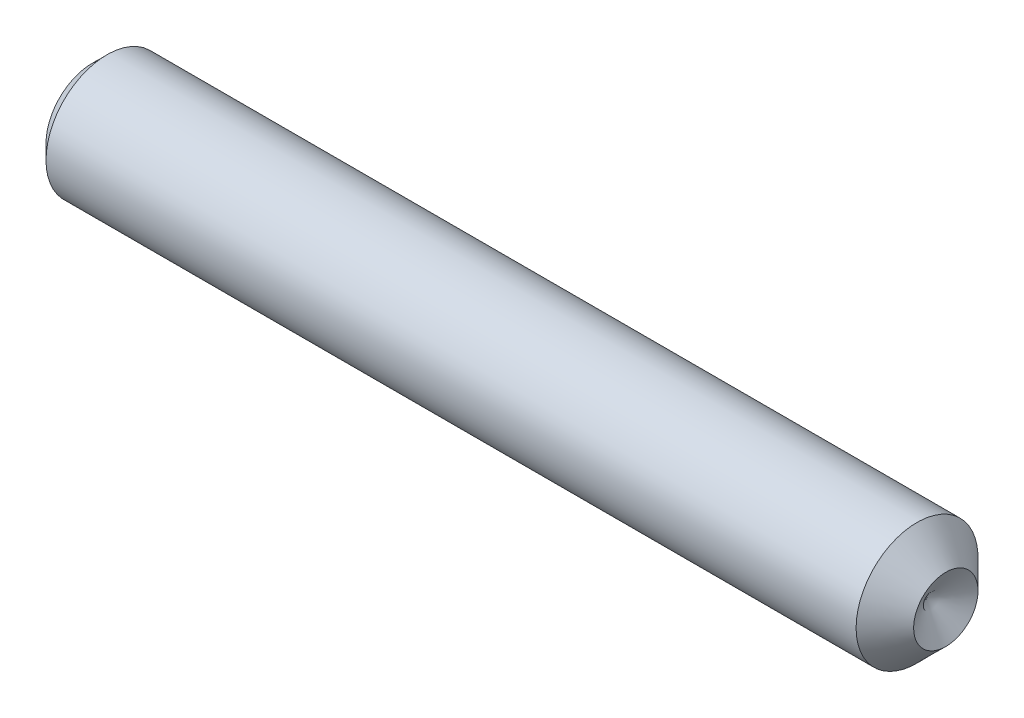
ISO-10303-21;
HEADER;
FILE_DESCRIPTION(('STEP AP214'),'2;1');
FILE_NAME('part.step','',(''),(''),'','','');
FILE_SCHEMA(('AUTOMOTIVE_DESIGN { 1 0 10303 214 1 1 1 1 }'));
ENDSEC;
DATA;
#1=APPLICATION_CONTEXT('core data for automotive mechanical design processes');
#2=APPLICATION_PROTOCOL_DEFINITION('international standard','automotive_design',2000,#1);
#3=PRODUCT_CONTEXT('',#1,'mechanical');
#4=PRODUCT('Part','Part','',(#3));
#5=PRODUCT_RELATED_PRODUCT_CATEGORY('part','',(#4));
#6=PRODUCT_DEFINITION_FORMATION('','',#4);
#7=PRODUCT_DEFINITION_CONTEXT('part definition',#1,'design');
#8=PRODUCT_DEFINITION('design','',#6,#7);
#9=PRODUCT_DEFINITION_SHAPE('','',#8);
#10=(LENGTH_UNIT() NAMED_UNIT(*) SI_UNIT(.MILLI.,.METRE.));
#11=(NAMED_UNIT(*) PLANE_ANGLE_UNIT() SI_UNIT($,.RADIAN.));
#12=(NAMED_UNIT(*) SI_UNIT($,.STERADIAN.) SOLID_ANGLE_UNIT());
#13=UNCERTAINTY_MEASURE_WITH_UNIT(LENGTH_MEASURE(1.E-05),#10,'distance_accuracy_value','');
#14=(GEOMETRIC_REPRESENTATION_CONTEXT(3) GLOBAL_UNCERTAINTY_ASSIGNED_CONTEXT((#13)) GLOBAL_UNIT_ASSIGNED_CONTEXT((#10,
#11,#12)) REPRESENTATION_CONTEXT('',''));
#15=CARTESIAN_POINT('',(0.,0.,0.));
#16=DIRECTION('',(0.,0.,1.));
#17=DIRECTION('',(1.,0.,0.));
#18=AXIS2_PLACEMENT_3D('',#15,#16,#17);
#19=CARTESIAN_POINT('',(0.,0.,0.));
#20=DIRECTION('',(-1.,0.,0.));
#21=DIRECTION('',(0.,0.,1.));
#22=AXIS2_PLACEMENT_3D('',#19,#20,#21);
#23=PLANE('',#22);
#24=CARTESIAN_POINT('',(0.,0.,0.));
#25=DIRECTION('',(-1.,0.,0.));
#26=DIRECTION('',(0.,0.,1.));
#27=AXIS2_PLACEMENT_3D('',#24,#25,#26);
#28=CIRCLE('',#27,2.41935);
#29=CARTESIAN_POINT('',(0.,0.,2.41935));
#30=VERTEX_POINT('',#29);
#31=EDGE_CURVE('E11',#30,#30,#28,.T.);
#32=ORIENTED_EDGE('',*,*,#31,.T.);
#33=EDGE_LOOP('',(#32));
#34=FACE_BOUND('',#33,.T.);
#35=DIRECTION('',(0.,0.,-1.));
#36=VECTOR('',#35,1.);
#37=CARTESIAN_POINT('',(0.,1.58750000000001,0.916543552338537));
#38=LINE('',#37,#36);
#39=CARTESIAN_POINT('',(0.,1.58750000000001,0.916543552338537));
#40=VERTEX_POINT('',#39);
#41=CARTESIAN_POINT('',(0.,1.58750000000001,-0.916543552338529));
#42=VERTEX_POINT('',#41);
#43=EDGE_CURVE('E94',#40,#42,#38,.T.);
#44=ORIENTED_EDGE('',*,*,#43,.F.);
#45=DIRECTION('',(0.,-0.86602540378444,0.499999999999998));
#46=VECTOR('',#45,1.);
#47=CARTESIAN_POINT('',(0.,1.58750000000001,0.916543552338537));
#48=LINE('',#47,#46);
#49=CARTESIAN_POINT('',(0.,0.,1.83308710467707));
#50=VERTEX_POINT('',#49);
#51=EDGE_CURVE('E47',#40,#50,#48,.T.);
#52=ORIENTED_EDGE('',*,*,#51,.T.);
#53=DIRECTION('',(0.,0.866025403784439,0.5));
#54=VECTOR('',#53,1.);
#55=CARTESIAN_POINT('',(0.,-1.5875,0.916543552338534));
#56=LINE('',#55,#54);
#57=CARTESIAN_POINT('',(0.,-1.5875,0.916543552338534));
#58=VERTEX_POINT('',#57);
#59=EDGE_CURVE('E100',#58,#50,#56,.T.);
#60=ORIENTED_EDGE('',*,*,#59,.F.);
#61=DIRECTION('',(0.,0.,-1.));
#62=VECTOR('',#61,1.);
#63=CARTESIAN_POINT('',(0.,-1.5875,0.916543552338534));
#64=LINE('',#63,#62);
#65=CARTESIAN_POINT('',(0.,-1.5875,-0.916543552338532));
#66=VERTEX_POINT('',#65);
#67=EDGE_CURVE('E120',#58,#66,#64,.T.);
#68=ORIENTED_EDGE('',*,*,#67,.T.);
#69=DIRECTION('',(0.,0.86602540378444,-0.499999999999998));
#70=VECTOR('',#69,1.);
#71=CARTESIAN_POINT('',(0.,-1.5875,-0.916543552338532));
#72=LINE('',#71,#70);
#73=CARTESIAN_POINT('',(0.,0.,-1.83308710467706));
#74=VERTEX_POINT('',#73);
#75=EDGE_CURVE('E123',#66,#74,#72,.T.);
#76=ORIENTED_EDGE('',*,*,#75,.T.);
#77=DIRECTION('',(0.,-0.866025403784439,-0.5));
#78=VECTOR('',#77,1.);
#79=CARTESIAN_POINT('',(0.,1.58750000000001,-0.916543552338529));
#80=LINE('',#79,#78);
#81=EDGE_CURVE('E126',#42,#74,#80,.T.);
#82=ORIENTED_EDGE('',*,*,#81,.F.);
#83=EDGE_LOOP('',(#44,#52,#60,#68,#76,#82));
#84=FACE_BOUND('',#83,.T.);
#85=ADVANCED_FACE('F33',(#34,#84),#23,.T.);
#86=CARTESIAN_POINT('',(0.,0.,0.));
#87=DIRECTION('',(1.,0.,0.));
#88=DIRECTION('',(0.,0.,-1.));
#89=AXIS2_PLACEMENT_3D('',#86,#87,#88);
#90=CONICAL_SURFACE('',#89,2.41935,0.785398163397437);
#91=CARTESIAN_POINT('',(0.755650000000016,0.,0.));
#92=DIRECTION('',(-1.,0.,0.));
#93=DIRECTION('',(0.,0.,1.));
#94=AXIS2_PLACEMENT_3D('',#91,#92,#93);
#95=CIRCLE('',#94,3.175);
#96=CARTESIAN_POINT('',(0.755650000000016,0.,3.175));
#97=VERTEX_POINT('',#96);
#98=EDGE_CURVE('E40',#97,#97,#95,.T.);
#99=ORIENTED_EDGE('',*,*,#98,.T.);
#100=EDGE_LOOP('',(#99));
#101=FACE_BOUND('',#100,.T.);
#102=ORIENTED_EDGE('',*,*,#31,.F.);
#103=EDGE_LOOP('',(#102));
#104=FACE_BOUND('',#103,.T.);
#105=ADVANCED_FACE('F146',(#101,#104),#90,.T.);
#106=CARTESIAN_POINT('',(-12.7,0.,0.));
#107=DIRECTION('',(-1.,0.,0.));
#108=DIRECTION('',(0.,0.,1.));
#109=AXIS2_PLACEMENT_3D('',#106,#107,#108);
#110=CYLINDRICAL_SURFACE('',#109,3.175);
#111=CARTESIAN_POINT('',(42.9514,0.,0.));
#112=DIRECTION('',(-1.,0.,0.));
#113=DIRECTION('',(0.,0.,1.));
#114=AXIS2_PLACEMENT_3D('',#111,#112,#113);
#115=CIRCLE('',#114,3.175);
#116=CARTESIAN_POINT('',(42.9514,0.,3.175));
#117=VERTEX_POINT('',#116);
#118=EDGE_CURVE('E141',#117,#117,#115,.T.);
#119=ORIENTED_EDGE('',*,*,#118,.T.);
#120=EDGE_LOOP('',(#119));
#121=FACE_BOUND('',#120,.T.);
#122=ORIENTED_EDGE('',*,*,#98,.F.);
#123=EDGE_LOOP('',(#122));
#124=FACE_BOUND('',#123,.T.);
#125=ADVANCED_FACE('F149',(#121,#124),#110,.T.);
#126=CARTESIAN_POINT('',(42.9514,0.,0.));
#127=DIRECTION('',(-1.,0.,0.));
#128=DIRECTION('',(0.,0.,1.));
#129=AXIS2_PLACEMENT_3D('',#126,#127,#128);
#130=CONICAL_SURFACE('',#129,3.175,0.785398163397454);
#131=CARTESIAN_POINT('',(44.45,0.,0.));
#132=DIRECTION('',(-1.,0.,0.));
#133=DIRECTION('',(0.,0.,1.));
#134=AXIS2_PLACEMENT_3D('',#131,#132,#133);
#135=CIRCLE('',#134,1.6764);
#136=CARTESIAN_POINT('',(44.45,0.,1.6764));
#137=VERTEX_POINT('',#136);
#138=EDGE_CURVE('E101',#137,#137,#135,.T.);
#139=ORIENTED_EDGE('',*,*,#138,.T.);
#140=EDGE_LOOP('',(#139));
#141=FACE_BOUND('',#140,.T.);
#142=ORIENTED_EDGE('',*,*,#118,.F.);
#143=EDGE_LOOP('',(#142));
#144=FACE_BOUND('',#143,.T.);
#145=ADVANCED_FACE('F151',(#141,#144),#130,.T.);
#146=CARTESIAN_POINT('',(43.4427172582622,0.,0.));
#147=DIRECTION('',(1.,0.,0.));
#148=DIRECTION('',(0.,0.,-1.));
#149=AXIS2_PLACEMENT_3D('',#146,#147,#148);
#150=CONICAL_SURFACE('',#149,0.,1.02974425867665);
#151=ORIENTED_EDGE('',*,*,#138,.F.);
#152=EDGE_LOOP('',(#151));
#153=FACE_BOUND('',#152,.T.);
#154=CARTESIAN_POINT('',(43.4427172582622,0.,0.));
#155=VERTEX_POINT('',#154);
#156=VERTEX_LOOP('',#155);
#157=FACE_BOUND('',#156,.T.);
#158=ADVANCED_FACE('F158',(#153,#157),#150,.F.);
#159=CARTESIAN_POINT('',(3.175,1.58750000000001,0.916543552338537));
#160=DIRECTION('',(0.,-0.499999999999998,-0.86602540378444));
#161=DIRECTION('',(0.,0.86602540378444,-0.499999999999998));
#162=AXIS2_PLACEMENT_3D('',#159,#160,#161);
#163=PLANE('',#162);
#164=ORIENTED_EDGE('',*,*,#51,.F.);
#165=DIRECTION('',(-1.,0.,0.));
#166=VECTOR('',#165,1.);
#167=CARTESIAN_POINT('',(3.175,1.58750000000001,0.916543552338537));
#168=LINE('',#167,#166);
#169=CARTESIAN_POINT('',(3.175,1.58750000000001,0.916543552338537));
#170=VERTEX_POINT('',#169);
#171=EDGE_CURVE('E88',#170,#40,#168,.T.);
#172=ORIENTED_EDGE('',*,*,#171,.F.);
#173=DIRECTION('',(0.,-0.86602540378444,0.499999999999998));
#174=VECTOR('',#173,1.);
#175=CARTESIAN_POINT('',(3.175,1.58750000000001,0.916543552338537));
#176=LINE('',#175,#174);
#177=CARTESIAN_POINT('',(3.175,0.,1.83308710467707));
#178=VERTEX_POINT('',#177);
#179=EDGE_CURVE('E83',#170,#178,#176,.T.);
#180=ORIENTED_EDGE('',*,*,#179,.T.);
#181=DIRECTION('',(-1.,0.,0.));
#182=VECTOR('',#181,1.);
#183=CARTESIAN_POINT('',(3.175,0.,1.83308710467707));
#184=LINE('',#183,#182);
#185=EDGE_CURVE('E86',#178,#50,#184,.T.);
#186=ORIENTED_EDGE('',*,*,#185,.T.);
#187=EDGE_LOOP('',(#164,#172,#180,#186));
#188=FACE_BOUND('',#187,.T.);
#189=ADVANCED_FACE('F85',(#188),#163,.T.);
#190=CARTESIAN_POINT('',(3.175,-1.5875,0.916543552338534));
#191=DIRECTION('',(0.,-0.5,0.866025403784439));
#192=DIRECTION('',(0.,-0.866025403784439,-0.5));
#193=AXIS2_PLACEMENT_3D('',#190,#191,#192);
#194=PLANE('',#193);
#195=ORIENTED_EDGE('',*,*,#59,.T.);
#196=ORIENTED_EDGE('',*,*,#185,.F.);
#197=DIRECTION('',(0.,0.866025403784439,0.5));
#198=VECTOR('',#197,1.);
#199=CARTESIAN_POINT('',(3.175,-1.5875,0.916543552338534));
#200=LINE('',#199,#198);
#201=CARTESIAN_POINT('',(3.175,-1.5875,0.916543552338534));
#202=VERTEX_POINT('',#201);
#203=EDGE_CURVE('E93',#202,#178,#200,.T.);
#204=ORIENTED_EDGE('',*,*,#203,.F.);
#205=DIRECTION('',(-1.,0.,0.));
#206=VECTOR('',#205,1.);
#207=CARTESIAN_POINT('',(3.175,-1.5875,0.916543552338534));
#208=LINE('',#207,#206);
#209=EDGE_CURVE('E102',#202,#58,#208,.T.);
#210=ORIENTED_EDGE('',*,*,#209,.T.);
#211=EDGE_LOOP('',(#195,#196,#204,#210));
#212=FACE_BOUND('',#211,.T.);
#213=ADVANCED_FACE('F98',(#212),#194,.F.);
#214=CARTESIAN_POINT('',(3.175,-1.5875,0.916543552338534));
#215=DIRECTION('',(0.,1.,0.));
#216=DIRECTION('',(0.,0.,1.));
#217=AXIS2_PLACEMENT_3D('',#214,#215,#216);
#218=PLANE('',#217);
#219=ORIENTED_EDGE('',*,*,#67,.F.);
#220=ORIENTED_EDGE('',*,*,#209,.F.);
#221=DIRECTION('',(0.,0.,-1.));
#222=VECTOR('',#221,1.);
#223=CARTESIAN_POINT('',(3.175,-1.5875,0.916543552338534));
#224=LINE('',#223,#222);
#225=CARTESIAN_POINT('',(3.175,-1.5875,-0.916543552338532));
#226=VERTEX_POINT('',#225);
#227=EDGE_CURVE('E107',#202,#226,#224,.T.);
#228=ORIENTED_EDGE('',*,*,#227,.T.);
#229=DIRECTION('',(-1.,0.,0.));
#230=VECTOR('',#229,1.);
#231=CARTESIAN_POINT('',(3.175,-1.5875,-0.916543552338532));
#232=LINE('',#231,#230);
#233=EDGE_CURVE('E136',#226,#66,#232,.T.);
#234=ORIENTED_EDGE('',*,*,#233,.T.);
#235=EDGE_LOOP('',(#219,#220,#228,#234));
#236=FACE_BOUND('',#235,.T.);
#237=ADVANCED_FACE('F181',(#236),#218,.T.);
#238=CARTESIAN_POINT('',(3.175,-1.5875,-0.916543552338532));
#239=DIRECTION('',(0.,0.499999999999998,0.86602540378444));
#240=DIRECTION('',(0.,-0.86602540378444,0.499999999999998));
#241=AXIS2_PLACEMENT_3D('',#238,#239,#240);
#242=PLANE('',#241);
#243=ORIENTED_EDGE('',*,*,#75,.F.);
#244=ORIENTED_EDGE('',*,*,#233,.F.);
#245=DIRECTION('',(0.,0.86602540378444,-0.499999999999998));
#246=VECTOR('',#245,1.);
#247=CARTESIAN_POINT('',(3.175,-1.5875,-0.916543552338532));
#248=LINE('',#247,#246);
#249=CARTESIAN_POINT('',(3.175,0.,-1.83308710467706));
#250=VERTEX_POINT('',#249);
#251=EDGE_CURVE('E109',#226,#250,#248,.T.);
#252=ORIENTED_EDGE('',*,*,#251,.T.);
#253=DIRECTION('',(-1.,0.,0.));
#254=VECTOR('',#253,1.);
#255=CARTESIAN_POINT('',(3.175,0.,-1.83308710467706));
#256=LINE('',#255,#254);
#257=EDGE_CURVE('E134',#250,#74,#256,.T.);
#258=ORIENTED_EDGE('',*,*,#257,.T.);
#259=EDGE_LOOP('',(#243,#244,#252,#258));
#260=FACE_BOUND('',#259,.T.);
#261=ADVANCED_FACE('F177',(#260),#242,.T.);
#262=CARTESIAN_POINT('',(3.175,1.58750000000001,-0.916543552338529));
#263=DIRECTION('',(0.,0.5,-0.866025403784439));
#264=DIRECTION('',(0.,0.866025403784439,0.5));
#265=AXIS2_PLACEMENT_3D('',#262,#263,#264);
#266=PLANE('',#265);
#267=ORIENTED_EDGE('',*,*,#81,.T.);
#268=ORIENTED_EDGE('',*,*,#257,.F.);
#269=DIRECTION('',(0.,-0.866025403784439,-0.5));
#270=VECTOR('',#269,1.);
#271=CARTESIAN_POINT('',(3.175,1.58750000000001,-0.916543552338529));
#272=LINE('',#271,#270);
#273=CARTESIAN_POINT('',(3.175,1.58750000000001,-0.916543552338529));
#274=VERTEX_POINT('',#273);
#275=EDGE_CURVE('E113',#274,#250,#272,.T.);
#276=ORIENTED_EDGE('',*,*,#275,.F.);
#277=DIRECTION('',(-1.,0.,0.));
#278=VECTOR('',#277,1.);
#279=CARTESIAN_POINT('',(3.175,1.58750000000001,-0.916543552338529));
#280=LINE('',#279,#278);
#281=EDGE_CURVE('E132',#274,#42,#280,.T.);
#282=ORIENTED_EDGE('',*,*,#281,.T.);
#283=EDGE_LOOP('',(#267,#268,#276,#282));
#284=FACE_BOUND('',#283,.T.);
#285=ADVANCED_FACE('F174',(#284),#266,.F.);
#286=CARTESIAN_POINT('',(3.175,1.58750000000001,0.916543552338537));
#287=DIRECTION('',(0.,1.,0.));
#288=DIRECTION('',(0.,0.,1.));
#289=AXIS2_PLACEMENT_3D('',#286,#287,#288);
#290=PLANE('',#289);
#291=ORIENTED_EDGE('',*,*,#43,.T.);
#292=ORIENTED_EDGE('',*,*,#281,.F.);
#293=DIRECTION('',(0.,0.,-1.));
#294=VECTOR('',#293,1.);
#295=CARTESIAN_POINT('',(3.175,1.58750000000001,0.916543552338537));
#296=LINE('',#295,#294);
#297=EDGE_CURVE('E116',#170,#274,#296,.T.);
#298=ORIENTED_EDGE('',*,*,#297,.F.);
#299=ORIENTED_EDGE('',*,*,#171,.T.);
#300=EDGE_LOOP('',(#291,#292,#298,#299));
#301=FACE_BOUND('',#300,.T.);
#302=ADVANCED_FACE('F170',(#301),#290,.F.);
#303=CARTESIAN_POINT('',(3.175,1.58750000000001,0.916543552338537));
#304=DIRECTION('',(1.,0.,0.));
#305=DIRECTION('',(0.,0.,-1.));
#306=AXIS2_PLACEMENT_3D('',#303,#304,#305);
#307=PLANE('',#306);
#308=ORIENTED_EDGE('',*,*,#179,.F.);
#309=ORIENTED_EDGE('',*,*,#297,.T.);
#310=ORIENTED_EDGE('',*,*,#275,.T.);
#311=ORIENTED_EDGE('',*,*,#251,.F.);
#312=ORIENTED_EDGE('',*,*,#227,.F.);
#313=ORIENTED_EDGE('',*,*,#203,.T.);
#314=EDGE_LOOP('',(#308,#309,#310,#311,#312,#313));
#315=FACE_BOUND('',#314,.T.);
#316=ADVANCED_FACE('F105',(#315),#307,.F.);
#317=CLOSED_SHELL('',(#85,#105,#125,#145,#158,#189,#213,#237,#261,#285,#302,#316));
#318=MANIFOLD_SOLID_BREP('B2',#317);
#319=ADVANCED_BREP_SHAPE_REPRESENTATION('',(#18,#318),#14);
#320=SHAPE_DEFINITION_REPRESENTATION(#9,#319);
ENDSEC;
END-ISO-10303-21;
